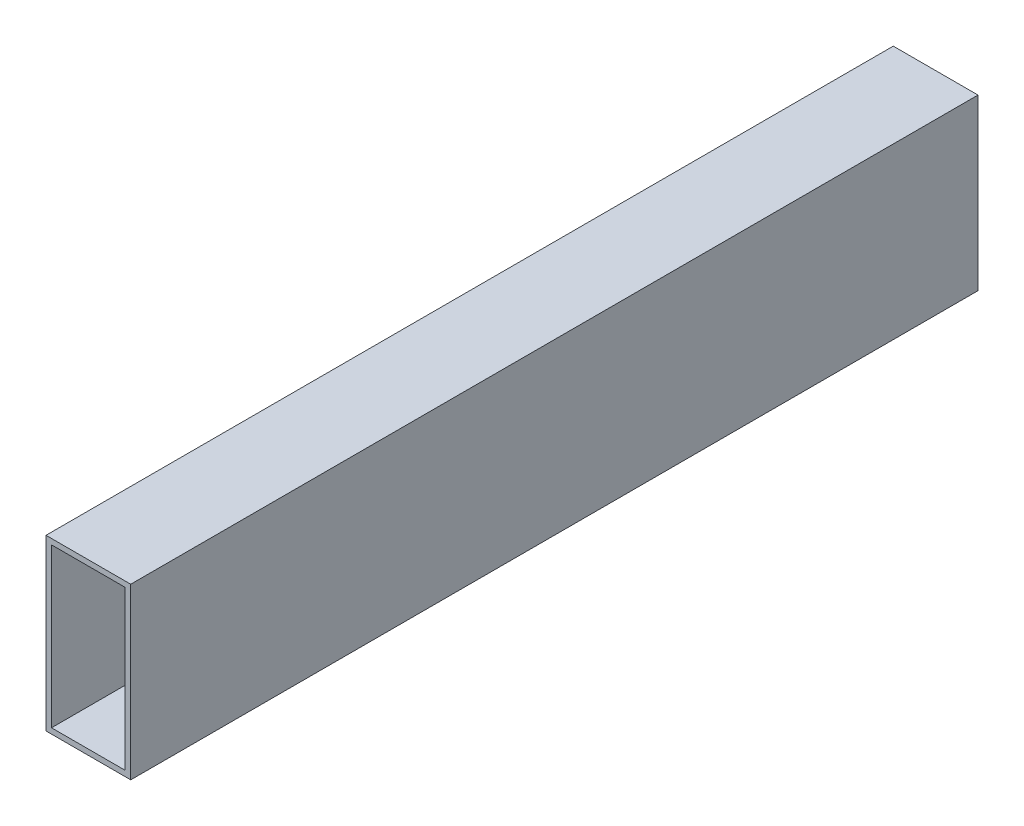
ISO-10303-21;
HEADER;
FILE_DESCRIPTION(('STEP AP214'),'2;1');
FILE_NAME('part.step','',(''),(''),'','','');
FILE_SCHEMA(('AUTOMOTIVE_DESIGN { 1 0 10303 214 1 1 1 1 }'));
ENDSEC;
DATA;
#1=APPLICATION_CONTEXT('core data for automotive mechanical design processes');
#2=APPLICATION_PROTOCOL_DEFINITION('international standard','automotive_design',2000,#1);
#3=PRODUCT_CONTEXT('',#1,'mechanical');
#4=PRODUCT('Part','Part','',(#3));
#5=PRODUCT_RELATED_PRODUCT_CATEGORY('part','',(#4));
#6=PRODUCT_DEFINITION_FORMATION('','',#4);
#7=PRODUCT_DEFINITION_CONTEXT('part definition',#1,'design');
#8=PRODUCT_DEFINITION('design','',#6,#7);
#9=PRODUCT_DEFINITION_SHAPE('','',#8);
#10=(LENGTH_UNIT() NAMED_UNIT(*) SI_UNIT(.MILLI.,.METRE.));
#11=(NAMED_UNIT(*) PLANE_ANGLE_UNIT() SI_UNIT($,.RADIAN.));
#12=(NAMED_UNIT(*) SI_UNIT($,.STERADIAN.) SOLID_ANGLE_UNIT());
#13=UNCERTAINTY_MEASURE_WITH_UNIT(LENGTH_MEASURE(1.E-05),#10,'distance_accuracy_value','');
#14=(GEOMETRIC_REPRESENTATION_CONTEXT(3) GLOBAL_UNCERTAINTY_ASSIGNED_CONTEXT((#13)) GLOBAL_UNIT_ASSIGNED_CONTEXT((#10,
#11,#12)) REPRESENTATION_CONTEXT('',''));
#15=CARTESIAN_POINT('',(0.,0.,0.));
#16=DIRECTION('',(0.,0.,1.));
#17=DIRECTION('',(1.,0.,0.));
#18=AXIS2_PLACEMENT_3D('',#15,#16,#17);
#19=CARTESIAN_POINT('',(-48.4372093023255,-30.1994186046511,254.));
#20=DIRECTION('',(1.,0.,0.));
#21=DIRECTION('',(0.,0.,-1.));
#22=AXIS2_PLACEMENT_3D('',#19,#20,#21);
#23=PLANE('',#22);
#24=DIRECTION('',(0.,-1.,0.));
#25=VECTOR('',#24,1.);
#26=CARTESIAN_POINT('',(-48.4372093023255,-30.1994186046511,0.));
#27=LINE('',#26,#25);
#28=CARTESIAN_POINT('',(-48.4372093023255,20.6005813953489,0.));
#29=VERTEX_POINT('',#28);
#30=CARTESIAN_POINT('',(-48.4372093023255,-30.1994186046511,0.));
#31=VERTEX_POINT('',#30);
#32=EDGE_CURVE('E129',#29,#31,#27,.T.);
#33=ORIENTED_EDGE('',*,*,#32,.T.);
#34=DIRECTION('',(0.,0.,-1.));
#35=VECTOR('',#34,1.);
#36=CARTESIAN_POINT('',(-48.4372093023255,-30.1994186046511,254.));
#37=LINE('',#36,#35);
#38=CARTESIAN_POINT('',(-48.4372093023255,-30.1994186046511,254.));
#39=VERTEX_POINT('',#38);
#40=EDGE_CURVE('E11',#39,#31,#37,.T.);
#41=ORIENTED_EDGE('',*,*,#40,.F.);
#42=DIRECTION('',(0.,-1.,0.));
#43=VECTOR('',#42,1.);
#44=CARTESIAN_POINT('',(-48.4372093023255,-30.1994186046511,254.));
#45=LINE('',#44,#43);
#46=CARTESIAN_POINT('',(-48.4372093023255,20.6005813953489,254.));
#47=VERTEX_POINT('',#46);
#48=EDGE_CURVE('E133',#47,#39,#45,.T.);
#49=ORIENTED_EDGE('',*,*,#48,.F.);
#50=DIRECTION('',(0.,0.,-1.));
#51=VECTOR('',#50,1.);
#52=CARTESIAN_POINT('',(-48.4372093023255,20.6005813953489,254.));
#53=LINE('',#52,#51);
#54=EDGE_CURVE('E143',#47,#29,#53,.T.);
#55=ORIENTED_EDGE('',*,*,#54,.T.);
#56=EDGE_LOOP('',(#33,#41,#49,#55));
#57=FACE_BOUND('',#56,.T.);
#58=ADVANCED_FACE('F32',(#57),#23,.F.);
#59=CARTESIAN_POINT('',(-48.4372093023255,-30.1994186046511,254.));
#60=DIRECTION('',(0.,1.,0.));
#61=DIRECTION('',(0.,0.,1.));
#62=AXIS2_PLACEMENT_3D('',#59,#60,#61);
#63=PLANE('',#62);
#64=DIRECTION('',(1.,0.,0.));
#65=VECTOR('',#64,1.);
#66=CARTESIAN_POINT('',(-48.4372093023255,-30.1994186046511,0.));
#67=LINE('',#66,#65);
#68=CARTESIAN_POINT('',(-23.0372093023255,-30.1994186046511,0.));
#69=VERTEX_POINT('',#68);
#70=EDGE_CURVE('E146',#31,#69,#67,.T.);
#71=ORIENTED_EDGE('',*,*,#70,.T.);
#72=DIRECTION('',(0.,0.,-1.));
#73=VECTOR('',#72,1.);
#74=CARTESIAN_POINT('',(-23.0372093023255,-30.1994186046511,254.));
#75=LINE('',#74,#73);
#76=CARTESIAN_POINT('',(-23.0372093023255,-30.1994186046511,254.));
#77=VERTEX_POINT('',#76);
#78=EDGE_CURVE('E39',#77,#69,#75,.T.);
#79=ORIENTED_EDGE('',*,*,#78,.F.);
#80=DIRECTION('',(1.,0.,0.));
#81=VECTOR('',#80,1.);
#82=CARTESIAN_POINT('',(-48.4372093023255,-30.1994186046511,254.));
#83=LINE('',#82,#81);
#84=EDGE_CURVE('E136',#39,#77,#83,.T.);
#85=ORIENTED_EDGE('',*,*,#84,.F.);
#86=ORIENTED_EDGE('',*,*,#40,.T.);
#87=EDGE_LOOP('',(#71,#79,#85,#86));
#88=FACE_BOUND('',#87,.T.);
#89=ADVANCED_FACE('F174',(#88),#63,.F.);
#90=CARTESIAN_POINT('',(-23.0372093023255,-30.1994186046511,254.));
#91=DIRECTION('',(-1.,0.,0.));
#92=DIRECTION('',(0.,-1.,0.));
#93=AXIS2_PLACEMENT_3D('',#90,#91,#92);
#94=PLANE('',#93);
#95=DIRECTION('',(0.,1.,0.));
#96=VECTOR('',#95,1.);
#97=CARTESIAN_POINT('',(-23.0372093023255,-30.1994186046511,0.));
#98=LINE('',#97,#96);
#99=CARTESIAN_POINT('',(-23.0372093023255,20.6005813953489,0.));
#100=VERTEX_POINT('',#99);
#101=EDGE_CURVE('E148',#69,#100,#98,.T.);
#102=ORIENTED_EDGE('',*,*,#101,.T.);
#103=DIRECTION('',(0.,0.,-1.));
#104=VECTOR('',#103,1.);
#105=CARTESIAN_POINT('',(-23.0372093023255,20.6005813953489,254.));
#106=LINE('',#105,#104);
#107=CARTESIAN_POINT('',(-23.0372093023255,20.6005813953489,254.));
#108=VERTEX_POINT('',#107);
#109=EDGE_CURVE('E153',#108,#100,#106,.T.);
#110=ORIENTED_EDGE('',*,*,#109,.F.);
#111=DIRECTION('',(0.,1.,0.));
#112=VECTOR('',#111,1.);
#113=CARTESIAN_POINT('',(-23.0372093023255,-30.1994186046511,254.));
#114=LINE('',#113,#112);
#115=EDGE_CURVE('E139',#77,#108,#114,.T.);
#116=ORIENTED_EDGE('',*,*,#115,.F.);
#117=ORIENTED_EDGE('',*,*,#78,.T.);
#118=EDGE_LOOP('',(#102,#110,#116,#117));
#119=FACE_BOUND('',#118,.T.);
#120=ADVANCED_FACE('F160',(#119),#94,.F.);
#121=CARTESIAN_POINT('',(-48.4372093023255,20.6005813953489,254.));
#122=DIRECTION('',(0.,-1.,0.));
#123=DIRECTION('',(0.,0.,-1.));
#124=AXIS2_PLACEMENT_3D('',#121,#122,#123);
#125=PLANE('',#124);
#126=DIRECTION('',(-1.,0.,0.));
#127=VECTOR('',#126,1.);
#128=CARTESIAN_POINT('',(-48.4372093023255,20.6005813953489,0.));
#129=LINE('',#128,#127);
#130=EDGE_CURVE('E137',#100,#29,#129,.T.);
#131=ORIENTED_EDGE('',*,*,#130,.T.);
#132=ORIENTED_EDGE('',*,*,#54,.F.);
#133=DIRECTION('',(-1.,0.,0.));
#134=VECTOR('',#133,1.);
#135=CARTESIAN_POINT('',(-48.4372093023255,20.6005813953489,254.));
#136=LINE('',#135,#134);
#137=EDGE_CURVE('E141',#108,#47,#136,.T.);
#138=ORIENTED_EDGE('',*,*,#137,.F.);
#139=ORIENTED_EDGE('',*,*,#109,.T.);
#140=EDGE_LOOP('',(#131,#132,#138,#139));
#141=FACE_BOUND('',#140,.T.);
#142=ADVANCED_FACE('F167',(#141),#125,.F.);
#143=CARTESIAN_POINT('',(0.,0.,254.));
#144=DIRECTION('',(0.,0.,-1.));
#145=DIRECTION('',(-1.,0.,0.));
#146=AXIS2_PLACEMENT_3D('',#143,#144,#145);
#147=PLANE('',#146);
#148=DIRECTION('',(-1.,0.,0.));
#149=VECTOR('',#148,1.);
#150=CARTESIAN_POINT('',(-46.7862093023255,18.9495813953489,254.));
#151=LINE('',#150,#149);
#152=CARTESIAN_POINT('',(-24.6882093023255,18.9495813953489,254.));
#153=VERTEX_POINT('',#152);
#154=CARTESIAN_POINT('',(-46.7862093023255,18.9495813953489,254.));
#155=VERTEX_POINT('',#154);
#156=EDGE_CURVE('E123',#153,#155,#151,.T.);
#157=ORIENTED_EDGE('',*,*,#156,.F.);
#158=DIRECTION('',(0.,1.,0.));
#159=VECTOR('',#158,1.);
#160=CARTESIAN_POINT('',(-24.6882093023255,18.9495813953489,254.));
#161=LINE('',#160,#159);
#162=CARTESIAN_POINT('',(-24.6882093023255,-28.5484186046511,254.));
#163=VERTEX_POINT('',#162);
#164=EDGE_CURVE('E46',#163,#153,#161,.T.);
#165=ORIENTED_EDGE('',*,*,#164,.F.);
#166=DIRECTION('',(1.,0.,0.));
#167=VECTOR('',#166,1.);
#168=CARTESIAN_POINT('',(-46.7862093023255,-28.5484186046511,254.));
#169=LINE('',#168,#167);
#170=CARTESIAN_POINT('',(-46.7862093023255,-28.5484186046511,254.));
#171=VERTEX_POINT('',#170);
#172=EDGE_CURVE('E114',#171,#163,#169,.T.);
#173=ORIENTED_EDGE('',*,*,#172,.F.);
#174=DIRECTION('',(0.,-1.,0.));
#175=VECTOR('',#174,1.);
#176=CARTESIAN_POINT('',(-46.7862093023255,18.9495813953489,254.));
#177=LINE('',#176,#175);
#178=EDGE_CURVE('E117',#155,#171,#177,.T.);
#179=ORIENTED_EDGE('',*,*,#178,.F.);
#180=EDGE_LOOP('',(#157,#165,#173,#179));
#181=FACE_BOUND('',#180,.T.);
#182=ORIENTED_EDGE('',*,*,#48,.T.);
#183=ORIENTED_EDGE('',*,*,#84,.T.);
#184=ORIENTED_EDGE('',*,*,#115,.T.);
#185=ORIENTED_EDGE('',*,*,#137,.T.);
#186=EDGE_LOOP('',(#182,#183,#184,#185));
#187=FACE_BOUND('',#186,.T.);
#188=ADVANCED_FACE('F173',(#181,#187),#147,.F.);
#189=CARTESIAN_POINT('',(0.,0.,0.));
#190=DIRECTION('',(0.,0.,-1.));
#191=DIRECTION('',(-1.,0.,0.));
#192=AXIS2_PLACEMENT_3D('',#189,#190,#191);
#193=PLANE('',#192);
#194=DIRECTION('',(0.,1.,0.));
#195=VECTOR('',#194,1.);
#196=CARTESIAN_POINT('',(-24.6882093023255,18.9495813953489,0.));
#197=LINE('',#196,#195);
#198=CARTESIAN_POINT('',(-24.6882093023255,-28.5484186046511,0.));
#199=VERTEX_POINT('',#198);
#200=CARTESIAN_POINT('',(-24.6882093023255,18.9495813953489,0.));
#201=VERTEX_POINT('',#200);
#202=EDGE_CURVE('E98',#199,#201,#197,.T.);
#203=ORIENTED_EDGE('',*,*,#202,.T.);
#204=DIRECTION('',(-1.,0.,0.));
#205=VECTOR('',#204,1.);
#206=CARTESIAN_POINT('',(-46.7862093023255,18.9495813953489,0.));
#207=LINE('',#206,#205);
#208=CARTESIAN_POINT('',(-46.7862093023255,18.9495813953489,0.));
#209=VERTEX_POINT('',#208);
#210=EDGE_CURVE('E107',#201,#209,#207,.T.);
#211=ORIENTED_EDGE('',*,*,#210,.T.);
#212=DIRECTION('',(0.,-1.,0.));
#213=VECTOR('',#212,1.);
#214=CARTESIAN_POINT('',(-46.7862093023255,18.9495813953489,0.));
#215=LINE('',#214,#213);
#216=CARTESIAN_POINT('',(-46.7862093023255,-28.5484186046511,0.));
#217=VERTEX_POINT('',#216);
#218=EDGE_CURVE('E54',#209,#217,#215,.T.);
#219=ORIENTED_EDGE('',*,*,#218,.T.);
#220=DIRECTION('',(1.,0.,0.));
#221=VECTOR('',#220,1.);
#222=CARTESIAN_POINT('',(-46.7862093023255,-28.5484186046511,0.));
#223=LINE('',#222,#221);
#224=EDGE_CURVE('E104',#217,#199,#223,.T.);
#225=ORIENTED_EDGE('',*,*,#224,.T.);
#226=EDGE_LOOP('',(#203,#211,#219,#225));
#227=FACE_BOUND('',#226,.T.);
#228=ORIENTED_EDGE('',*,*,#32,.F.);
#229=ORIENTED_EDGE('',*,*,#130,.F.);
#230=ORIENTED_EDGE('',*,*,#101,.F.);
#231=ORIENTED_EDGE('',*,*,#70,.F.);
#232=EDGE_LOOP('',(#228,#229,#230,#231));
#233=FACE_BOUND('',#232,.T.);
#234=ADVANCED_FACE('F111',(#227,#233),#193,.T.);
#235=CARTESIAN_POINT('',(-24.6882093023255,18.9495813953489,0.));
#236=DIRECTION('',(1.,0.,0.));
#237=DIRECTION('',(0.,1.,0.));
#238=AXIS2_PLACEMENT_3D('',#235,#236,#237);
#239=PLANE('',#238);
#240=ORIENTED_EDGE('',*,*,#164,.T.);
#241=DIRECTION('',(0.,0.,1.));
#242=VECTOR('',#241,1.);
#243=CARTESIAN_POINT('',(-24.6882093023255,18.9495813953489,0.));
#244=LINE('',#243,#242);
#245=EDGE_CURVE('E94',#201,#153,#244,.T.);
#246=ORIENTED_EDGE('',*,*,#245,.F.);
#247=ORIENTED_EDGE('',*,*,#202,.F.);
#248=DIRECTION('',(0.,0.,1.));
#249=VECTOR('',#248,1.);
#250=CARTESIAN_POINT('',(-24.6882093023255,-28.5484186046511,0.));
#251=LINE('',#250,#249);
#252=EDGE_CURVE('E127',#199,#163,#251,.T.);
#253=ORIENTED_EDGE('',*,*,#252,.T.);
#254=EDGE_LOOP('',(#240,#246,#247,#253));
#255=FACE_BOUND('',#254,.T.);
#256=ADVANCED_FACE('F96',(#255),#239,.F.);
#257=CARTESIAN_POINT('',(-46.7862093023255,-28.5484186046511,0.));
#258=DIRECTION('',(0.,-1.,0.));
#259=DIRECTION('',(0.,0.,-1.));
#260=AXIS2_PLACEMENT_3D('',#257,#258,#259);
#261=PLANE('',#260);
#262=ORIENTED_EDGE('',*,*,#172,.T.);
#263=ORIENTED_EDGE('',*,*,#252,.F.);
#264=ORIENTED_EDGE('',*,*,#224,.F.);
#265=DIRECTION('',(0.,0.,1.));
#266=VECTOR('',#265,1.);
#267=CARTESIAN_POINT('',(-46.7862093023255,-28.5484186046511,0.));
#268=LINE('',#267,#266);
#269=EDGE_CURVE('E130',#217,#171,#268,.T.);
#270=ORIENTED_EDGE('',*,*,#269,.T.);
#271=EDGE_LOOP('',(#262,#263,#264,#270));
#272=FACE_BOUND('',#271,.T.);
#273=ADVANCED_FACE('F191',(#272),#261,.F.);
#274=CARTESIAN_POINT('',(-46.7862093023255,18.9495813953489,0.));
#275=DIRECTION('',(-1.,0.,0.));
#276=DIRECTION('',(0.,-1.,0.));
#277=AXIS2_PLACEMENT_3D('',#274,#275,#276);
#278=PLANE('',#277);
#279=ORIENTED_EDGE('',*,*,#178,.T.);
#280=ORIENTED_EDGE('',*,*,#269,.F.);
#281=ORIENTED_EDGE('',*,*,#218,.F.);
#282=DIRECTION('',(0.,0.,1.));
#283=VECTOR('',#282,1.);
#284=CARTESIAN_POINT('',(-46.7862093023255,18.9495813953489,0.));
#285=LINE('',#284,#283);
#286=EDGE_CURVE('E103',#209,#155,#285,.T.);
#287=ORIENTED_EDGE('',*,*,#286,.T.);
#288=EDGE_LOOP('',(#279,#280,#281,#287));
#289=FACE_BOUND('',#288,.T.);
#290=ADVANCED_FACE('F194',(#289),#278,.F.);
#291=CARTESIAN_POINT('',(-46.7862093023255,18.9495813953489,0.));
#292=DIRECTION('',(0.,1.,0.));
#293=DIRECTION('',(0.,0.,1.));
#294=AXIS2_PLACEMENT_3D('',#291,#292,#293);
#295=PLANE('',#294);
#296=ORIENTED_EDGE('',*,*,#156,.T.);
#297=ORIENTED_EDGE('',*,*,#286,.F.);
#298=ORIENTED_EDGE('',*,*,#210,.F.);
#299=ORIENTED_EDGE('',*,*,#245,.T.);
#300=EDGE_LOOP('',(#296,#297,#298,#299));
#301=FACE_BOUND('',#300,.T.);
#302=ADVANCED_FACE('F108',(#301),#295,.F.);
#303=CLOSED_SHELL('',(#58,#89,#120,#142,#188,#234,#256,#273,#290,#302));
#304=MANIFOLD_SOLID_BREP('B2',#303);
#305=ADVANCED_BREP_SHAPE_REPRESENTATION('',(#18,#304),#14);
#306=SHAPE_DEFINITION_REPRESENTATION(#9,#305);
ENDSEC;
END-ISO-10303-21;
